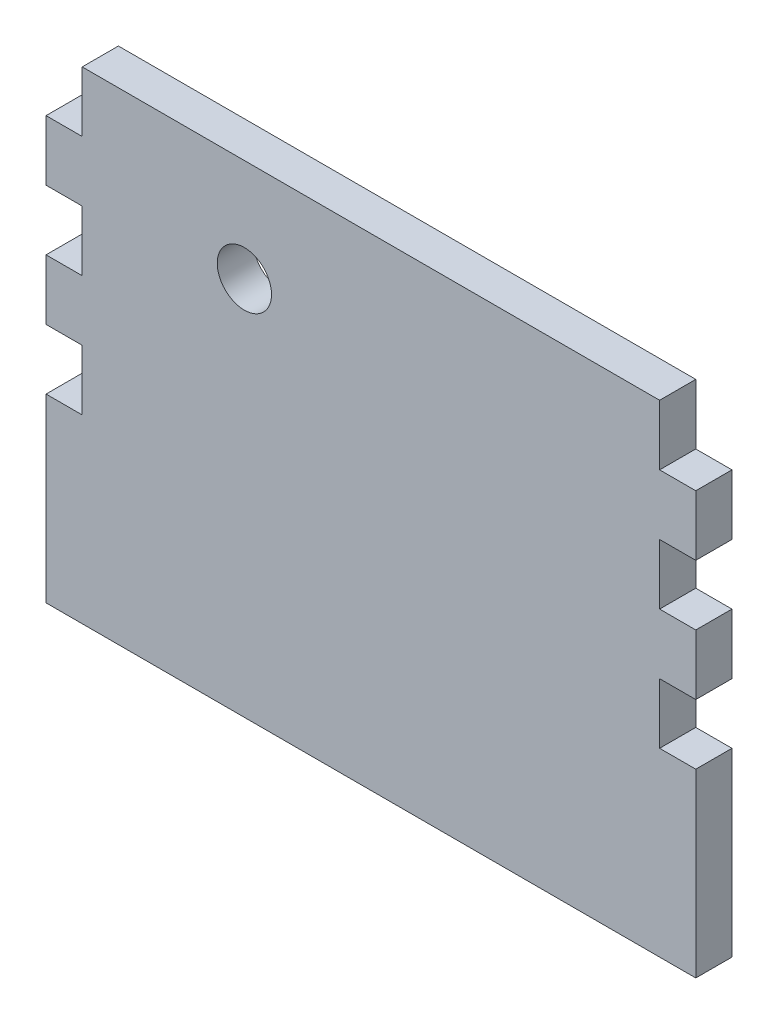
ISO-10303-21;
HEADER;
FILE_DESCRIPTION(('STEP AP214'),'2;1');
FILE_NAME('part.step','',(''),(''),'','','');
FILE_SCHEMA(('AUTOMOTIVE_DESIGN { 1 0 10303 214 1 1 1 1 }'));
ENDSEC;
DATA;
#1=APPLICATION_CONTEXT('core data for automotive mechanical design processes');
#2=APPLICATION_PROTOCOL_DEFINITION('international standard','automotive_design',2000,#1);
#3=PRODUCT_CONTEXT('',#1,'mechanical');
#4=PRODUCT('Part','Part','',(#3));
#5=PRODUCT_RELATED_PRODUCT_CATEGORY('part','',(#4));
#6=PRODUCT_DEFINITION_FORMATION('','',#4);
#7=PRODUCT_DEFINITION_CONTEXT('part definition',#1,'design');
#8=PRODUCT_DEFINITION('design','',#6,#7);
#9=PRODUCT_DEFINITION_SHAPE('','',#8);
#10=(LENGTH_UNIT() NAMED_UNIT(*) SI_UNIT(.MILLI.,.METRE.));
#11=(NAMED_UNIT(*) PLANE_ANGLE_UNIT() SI_UNIT($,.RADIAN.));
#12=(NAMED_UNIT(*) SI_UNIT($,.STERADIAN.) SOLID_ANGLE_UNIT());
#13=UNCERTAINTY_MEASURE_WITH_UNIT(LENGTH_MEASURE(1.E-05),#10,'distance_accuracy_value','');
#14=(GEOMETRIC_REPRESENTATION_CONTEXT(3) GLOBAL_UNCERTAINTY_ASSIGNED_CONTEXT((#13)) GLOBAL_UNIT_ASSIGNED_CONTEXT((#10,
#11,#12)) REPRESENTATION_CONTEXT('',''));
#15=CARTESIAN_POINT('',(0.,0.,0.));
#16=DIRECTION('',(0.,0.,1.));
#17=DIRECTION('',(1.,0.,0.));
#18=AXIS2_PLACEMENT_3D('',#15,#16,#17);
#19=CARTESIAN_POINT('',(-26.945,20.,3.));
#20=DIRECTION('',(1.,0.,0.));
#21=DIRECTION('',(0.,1.,0.));
#22=AXIS2_PLACEMENT_3D('',#19,#20,#21);
#23=PLANE('',#22);
#24=DIRECTION('',(0.,-1.,0.));
#25=VECTOR('',#24,1.);
#26=CARTESIAN_POINT('',(-26.945,20.,0.));
#27=LINE('',#26,#25);
#28=CARTESIAN_POINT('',(-26.945,4.99999999999999,0.));
#29=VERTEX_POINT('',#28);
#30=CARTESIAN_POINT('',(-26.945,0.,0.));
#31=VERTEX_POINT('',#30);
#32=EDGE_CURVE('E411',#29,#31,#27,.T.);
#33=ORIENTED_EDGE('',*,*,#32,.T.);
#34=DIRECTION('',(0.,0.,1.));
#35=VECTOR('',#34,1.);
#36=CARTESIAN_POINT('',(-26.945,0.,0.));
#37=LINE('',#36,#35);
#38=CARTESIAN_POINT('',(-26.945,0.,3.));
#39=VERTEX_POINT('',#38);
#40=EDGE_CURVE('E303',#31,#39,#37,.T.);
#41=ORIENTED_EDGE('',*,*,#40,.T.);
#42=DIRECTION('',(0.,-1.,0.));
#43=VECTOR('',#42,1.);
#44=CARTESIAN_POINT('',(-26.945,20.,3.));
#45=LINE('',#44,#43);
#46=CARTESIAN_POINT('',(-26.945,4.99999999999999,3.));
#47=VERTEX_POINT('',#46);
#48=EDGE_CURVE('E246',#47,#39,#45,.T.);
#49=ORIENTED_EDGE('',*,*,#48,.F.);
#50=DIRECTION('',(0.,0.,1.));
#51=VECTOR('',#50,1.);
#52=CARTESIAN_POINT('',(-26.945,4.99999999999999,0.));
#53=LINE('',#52,#51);
#54=EDGE_CURVE('E336',#29,#47,#53,.T.);
#55=ORIENTED_EDGE('',*,*,#54,.F.);
#56=EDGE_LOOP('',(#33,#41,#49,#55));
#57=FACE_BOUND('',#56,.T.);
#58=ADVANCED_FACE('F33',(#57),#23,.F.);
#59=CARTESIAN_POINT('',(-26.945,15.,0.));
#60=VERTEX_POINT('',#59);
#61=CARTESIAN_POINT('',(-26.945,9.99999999999999,0.));
#62=VERTEX_POINT('',#61);
#63=EDGE_CURVE('E257',#60,#62,#27,.T.);
#64=ORIENTED_EDGE('',*,*,#63,.T.);
#65=DIRECTION('',(0.,0.,1.));
#66=VECTOR('',#65,1.);
#67=CARTESIAN_POINT('',(-26.945,9.99999999999999,0.));
#68=LINE('',#67,#66);
#69=CARTESIAN_POINT('',(-26.945,9.99999999999999,3.));
#70=VERTEX_POINT('',#69);
#71=EDGE_CURVE('E268',#62,#70,#68,.T.);
#72=ORIENTED_EDGE('',*,*,#71,.T.);
#73=CARTESIAN_POINT('',(-26.945,15.,3.));
#74=VERTEX_POINT('',#73);
#75=EDGE_CURVE('E248',#74,#70,#45,.T.);
#76=ORIENTED_EDGE('',*,*,#75,.F.);
#77=DIRECTION('',(0.,0.,1.));
#78=VECTOR('',#77,1.);
#79=CARTESIAN_POINT('',(-26.945,15.,0.));
#80=LINE('',#79,#78);
#81=EDGE_CURVE('E258',#60,#74,#80,.T.);
#82=ORIENTED_EDGE('',*,*,#81,.F.);
#83=EDGE_LOOP('',(#64,#72,#76,#82));
#84=FACE_BOUND('',#83,.T.);
#85=ADVANCED_FACE('F418',(#84),#23,.F.);
#86=CARTESIAN_POINT('',(26.945,20.,3.));
#87=DIRECTION('',(1.,0.,0.));
#88=DIRECTION('',(0.,1.,0.));
#89=AXIS2_PLACEMENT_3D('',#86,#87,#88);
#90=PLANE('',#89);
#91=DIRECTION('',(0.,0.,1.));
#92=VECTOR('',#91,1.);
#93=CARTESIAN_POINT('',(26.945,-5.00000000000001,0.));
#94=LINE('',#93,#92);
#95=CARTESIAN_POINT('',(26.945,-5.00000000000001,0.));
#96=VERTEX_POINT('',#95);
#97=CARTESIAN_POINT('',(26.945,-5.00000000000001,3.));
#98=VERTEX_POINT('',#97);
#99=EDGE_CURVE('E279',#96,#98,#94,.T.);
#100=ORIENTED_EDGE('',*,*,#99,.T.);
#101=DIRECTION('',(0.,-1.,0.));
#102=VECTOR('',#101,1.);
#103=CARTESIAN_POINT('',(26.945,20.,3.));
#104=LINE('',#103,#102);
#105=CARTESIAN_POINT('',(26.945,-20.,3.));
#106=VERTEX_POINT('',#105);
#107=EDGE_CURVE('E251',#98,#106,#104,.T.);
#108=ORIENTED_EDGE('',*,*,#107,.T.);
#109=DIRECTION('',(0.,0.,-1.));
#110=VECTOR('',#109,1.);
#111=CARTESIAN_POINT('',(26.945,-20.,3.));
#112=LINE('',#111,#110);
#113=CARTESIAN_POINT('',(26.945,-20.,0.));
#114=VERTEX_POINT('',#113);
#115=EDGE_CURVE('E37',#106,#114,#112,.T.);
#116=ORIENTED_EDGE('',*,*,#115,.T.);
#117=DIRECTION('',(0.,-1.,0.));
#118=VECTOR('',#117,1.);
#119=CARTESIAN_POINT('',(26.945,20.,0.));
#120=LINE('',#119,#118);
#121=EDGE_CURVE('E226',#96,#114,#120,.T.);
#122=ORIENTED_EDGE('',*,*,#121,.F.);
#123=EDGE_LOOP('',(#100,#108,#116,#122));
#124=FACE_BOUND('',#123,.T.);
#125=ADVANCED_FACE('F402',(#124),#90,.T.);
#126=DIRECTION('',(0.,0.,1.));
#127=VECTOR('',#126,1.);
#128=CARTESIAN_POINT('',(26.945,0.,0.));
#129=LINE('',#128,#127);
#130=CARTESIAN_POINT('',(26.945,0.,0.));
#131=VERTEX_POINT('',#130);
#132=CARTESIAN_POINT('',(26.945,0.,3.));
#133=VERTEX_POINT('',#132);
#134=EDGE_CURVE('E272',#131,#133,#129,.T.);
#135=ORIENTED_EDGE('',*,*,#134,.F.);
#136=CARTESIAN_POINT('',(26.945,4.99999999999999,0.));
#137=VERTEX_POINT('',#136);
#138=EDGE_CURVE('E224',#137,#131,#120,.T.);
#139=ORIENTED_EDGE('',*,*,#138,.F.);
#140=DIRECTION('',(0.,0.,1.));
#141=VECTOR('',#140,1.);
#142=CARTESIAN_POINT('',(26.945,4.99999999999999,0.));
#143=LINE('',#142,#141);
#144=CARTESIAN_POINT('',(26.945,4.99999999999999,3.));
#145=VERTEX_POINT('',#144);
#146=EDGE_CURVE('E333',#137,#145,#143,.T.);
#147=ORIENTED_EDGE('',*,*,#146,.T.);
#148=EDGE_CURVE('E253',#145,#133,#104,.T.);
#149=ORIENTED_EDGE('',*,*,#148,.T.);
#150=EDGE_LOOP('',(#135,#139,#147,#149));
#151=FACE_BOUND('',#150,.T.);
#152=ADVANCED_FACE('F390',(#151),#90,.T.);
#153=CARTESIAN_POINT('',(-26.945,20.,3.));
#154=DIRECTION('',(0.,1.,0.));
#155=DIRECTION('',(0.,0.,1.));
#156=AXIS2_PLACEMENT_3D('',#153,#154,#155);
#157=PLANE('',#156);
#158=DIRECTION('',(0.,0.,1.));
#159=VECTOR('',#158,1.);
#160=CARTESIAN_POINT('',(23.945,20.,0.));
#161=LINE('',#160,#159);
#162=CARTESIAN_POINT('',(23.945,20.,0.));
#163=VERTEX_POINT('',#162);
#164=CARTESIAN_POINT('',(23.945,20.,3.));
#165=VERTEX_POINT('',#164);
#166=EDGE_CURVE('E320',#163,#165,#161,.T.);
#167=ORIENTED_EDGE('',*,*,#166,.F.);
#168=DIRECTION('',(1.,0.,0.));
#169=VECTOR('',#168,1.);
#170=CARTESIAN_POINT('',(-26.945,20.,0.));
#171=LINE('',#170,#169);
#172=CARTESIAN_POINT('',(-23.945,20.,0.));
#173=VERTEX_POINT('',#172);
#174=EDGE_CURVE('E232',#173,#163,#171,.T.);
#175=ORIENTED_EDGE('',*,*,#174,.F.);
#176=DIRECTION('',(0.,0.,1.));
#177=VECTOR('',#176,1.);
#178=CARTESIAN_POINT('',(-23.945,20.,0.));
#179=LINE('',#178,#177);
#180=CARTESIAN_POINT('',(-23.945,20.,3.));
#181=VERTEX_POINT('',#180);
#182=EDGE_CURVE('E237',#173,#181,#179,.T.);
#183=ORIENTED_EDGE('',*,*,#182,.T.);
#184=DIRECTION('',(1.,0.,0.));
#185=VECTOR('',#184,1.);
#186=CARTESIAN_POINT('',(-26.945,20.,3.));
#187=LINE('',#186,#185);
#188=EDGE_CURVE('E254',#181,#165,#187,.T.);
#189=ORIENTED_EDGE('',*,*,#188,.T.);
#190=EDGE_LOOP('',(#167,#175,#183,#189));
#191=FACE_BOUND('',#190,.T.);
#192=ADVANCED_FACE('F35',(#191),#157,.T.);
#193=CARTESIAN_POINT('',(-26.945,-5.00000000000001,3.));
#194=VERTEX_POINT('',#193);
#195=CARTESIAN_POINT('',(-26.945,-20.,3.));
#196=VERTEX_POINT('',#195);
#197=EDGE_CURVE('E244',#194,#196,#45,.T.);
#198=ORIENTED_EDGE('',*,*,#197,.F.);
#199=DIRECTION('',(0.,0.,1.));
#200=VECTOR('',#199,1.);
#201=CARTESIAN_POINT('',(-26.945,-5.00000000000001,0.));
#202=LINE('',#201,#200);
#203=CARTESIAN_POINT('',(-26.945,-5.00000000000001,0.));
#204=VERTEX_POINT('',#203);
#205=EDGE_CURVE('E296',#204,#194,#202,.T.);
#206=ORIENTED_EDGE('',*,*,#205,.F.);
#207=CARTESIAN_POINT('',(-26.945,-20.,0.));
#208=VERTEX_POINT('',#207);
#209=EDGE_CURVE('E228',#204,#208,#27,.T.);
#210=ORIENTED_EDGE('',*,*,#209,.T.);
#211=DIRECTION('',(0.,0.,-1.));
#212=VECTOR('',#211,1.);
#213=CARTESIAN_POINT('',(-26.945,-20.,3.));
#214=LINE('',#213,#212);
#215=EDGE_CURVE('E11',#196,#208,#214,.T.);
#216=ORIENTED_EDGE('',*,*,#215,.F.);
#217=EDGE_LOOP('',(#198,#206,#210,#216));
#218=FACE_BOUND('',#217,.T.);
#219=ADVANCED_FACE('F455',(#218),#23,.F.);
#220=CARTESIAN_POINT('',(-26.945,-20.,3.));
#221=DIRECTION('',(0.,1.,0.));
#222=DIRECTION('',(0.,0.,1.));
#223=AXIS2_PLACEMENT_3D('',#220,#221,#222);
#224=PLANE('',#223);
#225=DIRECTION('',(1.,0.,0.));
#226=VECTOR('',#225,1.);
#227=CARTESIAN_POINT('',(-26.945,-20.,0.));
#228=LINE('',#227,#226);
#229=EDGE_CURVE('E223',#208,#114,#228,.T.);
#230=ORIENTED_EDGE('',*,*,#229,.T.);
#231=ORIENTED_EDGE('',*,*,#115,.F.);
#232=DIRECTION('',(1.,0.,0.));
#233=VECTOR('',#232,1.);
#234=CARTESIAN_POINT('',(-26.945,-20.,3.));
#235=LINE('',#234,#233);
#236=EDGE_CURVE('E247',#196,#106,#235,.T.);
#237=ORIENTED_EDGE('',*,*,#236,.F.);
#238=ORIENTED_EDGE('',*,*,#215,.T.);
#239=EDGE_LOOP('',(#230,#231,#237,#238));
#240=FACE_BOUND('',#239,.T.);
#241=ADVANCED_FACE('F406',(#240),#224,.F.);
#242=DIRECTION('',(0.,0.,1.));
#243=VECTOR('',#242,1.);
#244=CARTESIAN_POINT('',(26.945,15.,0.));
#245=LINE('',#244,#243);
#246=CARTESIAN_POINT('',(26.945,15.,0.));
#247=VERTEX_POINT('',#246);
#248=CARTESIAN_POINT('',(26.945,15.,3.));
#249=VERTEX_POINT('',#248);
#250=EDGE_CURVE('E324',#247,#249,#245,.T.);
#251=ORIENTED_EDGE('',*,*,#250,.T.);
#252=CARTESIAN_POINT('',(26.945,9.99999999999999,3.));
#253=VERTEX_POINT('',#252);
#254=EDGE_CURVE('E214',#249,#253,#104,.T.);
#255=ORIENTED_EDGE('',*,*,#254,.T.);
#256=DIRECTION('',(0.,0.,1.));
#257=VECTOR('',#256,1.);
#258=CARTESIAN_POINT('',(26.945,9.99999999999999,0.));
#259=LINE('',#258,#257);
#260=CARTESIAN_POINT('',(26.945,9.99999999999999,0.));
#261=VERTEX_POINT('',#260);
#262=EDGE_CURVE('E198',#261,#253,#259,.T.);
#263=ORIENTED_EDGE('',*,*,#262,.F.);
#264=EDGE_CURVE('E212',#247,#261,#120,.T.);
#265=ORIENTED_EDGE('',*,*,#264,.F.);
#266=EDGE_LOOP('',(#251,#255,#263,#265));
#267=FACE_BOUND('',#266,.T.);
#268=ADVANCED_FACE('F211',(#267),#90,.T.);
#269=CARTESIAN_POINT('',(0.,0.,3.));
#270=DIRECTION('',(0.,0.,-1.));
#271=DIRECTION('',(-1.,0.,0.));
#272=AXIS2_PLACEMENT_3D('',#269,#270,#271);
#273=PLANE('',#272);
#274=CARTESIAN_POINT('',(-10.495,11.5,3.));
#275=DIRECTION('',(0.,0.,1.));
#276=DIRECTION('',(1.,0.,0.));
#277=AXIS2_PLACEMENT_3D('',#274,#275,#276);
#278=CIRCLE('',#277,2.25);
#279=CARTESIAN_POINT('',(-8.245,11.5,3.));
#280=VERTEX_POINT('',#279);
#281=EDGE_CURVE('E306',#280,#280,#278,.T.);
#282=ORIENTED_EDGE('',*,*,#281,.F.);
#283=EDGE_LOOP('',(#282));
#284=FACE_BOUND('',#283,.T.);
#285=ORIENTED_EDGE('',*,*,#107,.F.);
#286=DIRECTION('',(1.,0.,0.));
#287=VECTOR('',#286,1.);
#288=CARTESIAN_POINT('',(26.945,-5.00000000000001,3.));
#289=LINE('',#288,#287);
#290=CARTESIAN_POINT('',(23.945,-5.00000000000001,3.));
#291=VERTEX_POINT('',#290);
#292=EDGE_CURVE('E283',#291,#98,#289,.T.);
#293=ORIENTED_EDGE('',*,*,#292,.F.);
#294=DIRECTION('',(0.,-1.,0.));
#295=VECTOR('',#294,1.);
#296=CARTESIAN_POINT('',(23.945,0.,3.));
#297=LINE('',#296,#295);
#298=CARTESIAN_POINT('',(23.945,0.,3.));
#299=VERTEX_POINT('',#298);
#300=EDGE_CURVE('E286',#299,#291,#297,.T.);
#301=ORIENTED_EDGE('',*,*,#300,.F.);
#302=DIRECTION('',(-1.,0.,0.));
#303=VECTOR('',#302,1.);
#304=CARTESIAN_POINT('',(26.945,0.,3.));
#305=LINE('',#304,#303);
#306=EDGE_CURVE('E289',#133,#299,#305,.T.);
#307=ORIENTED_EDGE('',*,*,#306,.F.);
#308=ORIENTED_EDGE('',*,*,#148,.F.);
#309=DIRECTION('',(1.,0.,0.));
#310=VECTOR('',#309,1.);
#311=CARTESIAN_POINT('',(26.945,4.99999999999999,3.));
#312=LINE('',#311,#310);
#313=CARTESIAN_POINT('',(23.945,4.99999999999999,3.));
#314=VERTEX_POINT('',#313);
#315=EDGE_CURVE('E205',#314,#145,#312,.T.);
#316=ORIENTED_EDGE('',*,*,#315,.F.);
#317=DIRECTION('',(0.,-1.,0.));
#318=VECTOR('',#317,1.);
#319=CARTESIAN_POINT('',(23.945,4.99999999999999,3.));
#320=LINE('',#319,#318);
#321=CARTESIAN_POINT('',(23.945,9.99999999999999,3.));
#322=VERTEX_POINT('',#321);
#323=EDGE_CURVE('E372',#322,#314,#320,.T.);
#324=ORIENTED_EDGE('',*,*,#323,.F.);
#325=DIRECTION('',(-1.,0.,0.));
#326=VECTOR('',#325,1.);
#327=CARTESIAN_POINT('',(26.945,9.99999999999999,3.));
#328=LINE('',#327,#326);
#329=EDGE_CURVE('E364',#253,#322,#328,.T.);
#330=ORIENTED_EDGE('',*,*,#329,.F.);
#331=ORIENTED_EDGE('',*,*,#254,.F.);
#332=DIRECTION('',(1.,0.,0.));
#333=VECTOR('',#332,1.);
#334=CARTESIAN_POINT('',(26.945,15.,3.));
#335=LINE('',#334,#333);
#336=CARTESIAN_POINT('',(23.945,15.,3.));
#337=VERTEX_POINT('',#336);
#338=EDGE_CURVE('E327',#337,#249,#335,.T.);
#339=ORIENTED_EDGE('',*,*,#338,.F.);
#340=DIRECTION('',(0.,-1.,0.));
#341=VECTOR('',#340,1.);
#342=CARTESIAN_POINT('',(23.945,20.,3.));
#343=LINE('',#342,#341);
#344=EDGE_CURVE('E330',#165,#337,#343,.T.);
#345=ORIENTED_EDGE('',*,*,#344,.F.);
#346=ORIENTED_EDGE('',*,*,#188,.F.);
#347=DIRECTION('',(0.,1.,0.));
#348=VECTOR('',#347,1.);
#349=CARTESIAN_POINT('',(-23.945,20.,3.));
#350=LINE('',#349,#348);
#351=CARTESIAN_POINT('',(-23.945,15.,3.));
#352=VERTEX_POINT('',#351);
#353=EDGE_CURVE('E262',#352,#181,#350,.T.);
#354=ORIENTED_EDGE('',*,*,#353,.F.);
#355=DIRECTION('',(1.,0.,0.));
#356=VECTOR('',#355,1.);
#357=CARTESIAN_POINT('',(-26.945,15.,3.));
#358=LINE('',#357,#356);
#359=EDGE_CURVE('E265',#74,#352,#358,.T.);
#360=ORIENTED_EDGE('',*,*,#359,.F.);
#361=ORIENTED_EDGE('',*,*,#75,.T.);
#362=DIRECTION('',(-1.,0.,0.));
#363=VECTOR('',#362,1.);
#364=CARTESIAN_POINT('',(-26.945,9.99999999999999,3.));
#365=LINE('',#364,#363);
#366=CARTESIAN_POINT('',(-23.945,9.99999999999999,3.));
#367=VERTEX_POINT('',#366);
#368=EDGE_CURVE('E345',#367,#70,#365,.T.);
#369=ORIENTED_EDGE('',*,*,#368,.F.);
#370=DIRECTION('',(0.,1.,0.));
#371=VECTOR('',#370,1.);
#372=CARTESIAN_POINT('',(-23.945,4.99999999999999,3.));
#373=LINE('',#372,#371);
#374=CARTESIAN_POINT('',(-23.945,4.99999999999999,3.));
#375=VERTEX_POINT('',#374);
#376=EDGE_CURVE('E348',#375,#367,#373,.T.);
#377=ORIENTED_EDGE('',*,*,#376,.F.);
#378=DIRECTION('',(1.,0.,0.));
#379=VECTOR('',#378,1.);
#380=CARTESIAN_POINT('',(-26.945,4.99999999999999,3.));
#381=LINE('',#380,#379);
#382=EDGE_CURVE('E326',#47,#375,#381,.T.);
#383=ORIENTED_EDGE('',*,*,#382,.F.);
#384=ORIENTED_EDGE('',*,*,#48,.T.);
#385=DIRECTION('',(-1.,0.,0.));
#386=VECTOR('',#385,1.);
#387=CARTESIAN_POINT('',(-26.945,0.,3.));
#388=LINE('',#387,#386);
#389=CARTESIAN_POINT('',(-23.945,0.,3.));
#390=VERTEX_POINT('',#389);
#391=EDGE_CURVE('E307',#390,#39,#388,.T.);
#392=ORIENTED_EDGE('',*,*,#391,.F.);
#393=DIRECTION('',(0.,1.,0.));
#394=VECTOR('',#393,1.);
#395=CARTESIAN_POINT('',(-23.945,0.,3.));
#396=LINE('',#395,#394);
#397=CARTESIAN_POINT('',(-23.945,-5.00000000000001,3.));
#398=VERTEX_POINT('',#397);
#399=EDGE_CURVE('E310',#398,#390,#396,.T.);
#400=ORIENTED_EDGE('',*,*,#399,.F.);
#401=DIRECTION('',(1.,0.,0.));
#402=VECTOR('',#401,1.);
#403=CARTESIAN_POINT('',(-26.945,-5.00000000000001,3.));
#404=LINE('',#403,#402);
#405=EDGE_CURVE('E282',#194,#398,#404,.T.);
#406=ORIENTED_EDGE('',*,*,#405,.F.);
#407=ORIENTED_EDGE('',*,*,#197,.T.);
#408=ORIENTED_EDGE('',*,*,#236,.T.);
#409=EDGE_LOOP('',(#285,#293,#301,#307,#308,#316,#324,#330,#331,#339,#345,#346,#354,#360,#361,
#369,#377,#383,#384,#392,#400,#406,#407,#408));
#410=FACE_BOUND('',#409,.T.);
#411=ADVANCED_FACE('F394',(#284,#410),#273,.F.);
#412=CARTESIAN_POINT('',(0.,0.,0.));
#413=DIRECTION('',(0.,0.,-1.));
#414=DIRECTION('',(-1.,0.,0.));
#415=AXIS2_PLACEMENT_3D('',#412,#413,#414);
#416=PLANE('',#415);
#417=DIRECTION('',(1.,0.,0.));
#418=VECTOR('',#417,1.);
#419=CARTESIAN_POINT('',(26.945,-5.00000000000001,0.));
#420=LINE('',#419,#418);
#421=CARTESIAN_POINT('',(23.945,-5.00000000000001,0.));
#422=VERTEX_POINT('',#421);
#423=EDGE_CURVE('E275',#422,#96,#420,.T.);
#424=ORIENTED_EDGE('',*,*,#423,.T.);
#425=ORIENTED_EDGE('',*,*,#121,.T.);
#426=ORIENTED_EDGE('',*,*,#229,.F.);
#427=ORIENTED_EDGE('',*,*,#209,.F.);
#428=DIRECTION('',(1.,0.,0.));
#429=VECTOR('',#428,1.);
#430=CARTESIAN_POINT('',(-26.945,-5.00000000000001,0.));
#431=LINE('',#430,#429);
#432=CARTESIAN_POINT('',(-23.945,-5.00000000000001,0.));
#433=VERTEX_POINT('',#432);
#434=EDGE_CURVE('E309',#204,#433,#431,.T.);
#435=ORIENTED_EDGE('',*,*,#434,.T.);
#436=DIRECTION('',(0.,1.,0.));
#437=VECTOR('',#436,1.);
#438=CARTESIAN_POINT('',(-23.945,0.,0.));
#439=LINE('',#438,#437);
#440=CARTESIAN_POINT('',(-23.945,0.,0.));
#441=VERTEX_POINT('',#440);
#442=EDGE_CURVE('E56',#433,#441,#439,.T.);
#443=ORIENTED_EDGE('',*,*,#442,.T.);
#444=DIRECTION('',(-1.,0.,0.));
#445=VECTOR('',#444,1.);
#446=CARTESIAN_POINT('',(-26.945,0.,0.));
#447=LINE('',#446,#445);
#448=EDGE_CURVE('E299',#441,#31,#447,.T.);
#449=ORIENTED_EDGE('',*,*,#448,.T.);
#450=ORIENTED_EDGE('',*,*,#32,.F.);
#451=DIRECTION('',(1.,0.,0.));
#452=VECTOR('',#451,1.);
#453=CARTESIAN_POINT('',(-26.945,4.99999999999999,0.));
#454=LINE('',#453,#452);
#455=CARTESIAN_POINT('',(-23.945,4.99999999999999,0.));
#456=VERTEX_POINT('',#455);
#457=EDGE_CURVE('E347',#29,#456,#454,.T.);
#458=ORIENTED_EDGE('',*,*,#457,.T.);
#459=DIRECTION('',(0.,1.,0.));
#460=VECTOR('',#459,1.);
#461=CARTESIAN_POINT('',(-23.945,4.99999999999999,0.));
#462=LINE('',#461,#460);
#463=CARTESIAN_POINT('',(-23.945,9.99999999999999,0.));
#464=VERTEX_POINT('',#463);
#465=EDGE_CURVE('E355',#456,#464,#462,.T.);
#466=ORIENTED_EDGE('',*,*,#465,.T.);
#467=DIRECTION('',(-1.,0.,0.));
#468=VECTOR('',#467,1.);
#469=CARTESIAN_POINT('',(-26.945,9.99999999999999,0.));
#470=LINE('',#469,#468);
#471=EDGE_CURVE('E339',#464,#62,#470,.T.);
#472=ORIENTED_EDGE('',*,*,#471,.T.);
#473=ORIENTED_EDGE('',*,*,#63,.F.);
#474=DIRECTION('',(1.,0.,0.));
#475=VECTOR('',#474,1.);
#476=CARTESIAN_POINT('',(-26.945,15.,0.));
#477=LINE('',#476,#475);
#478=CARTESIAN_POINT('',(-23.945,15.,0.));
#479=VERTEX_POINT('',#478);
#480=EDGE_CURVE('E264',#60,#479,#477,.T.);
#481=ORIENTED_EDGE('',*,*,#480,.T.);
#482=DIRECTION('',(0.,1.,0.));
#483=VECTOR('',#482,1.);
#484=CARTESIAN_POINT('',(-23.945,20.,0.));
#485=LINE('',#484,#483);
#486=EDGE_CURVE('E260',#479,#173,#485,.T.);
#487=ORIENTED_EDGE('',*,*,#486,.T.);
#488=ORIENTED_EDGE('',*,*,#174,.T.);
#489=DIRECTION('',(0.,-1.,0.));
#490=VECTOR('',#489,1.);
#491=CARTESIAN_POINT('',(23.945,20.,0.));
#492=LINE('',#491,#490);
#493=CARTESIAN_POINT('',(23.945,15.,0.));
#494=VERTEX_POINT('',#493);
#495=EDGE_CURVE('E329',#163,#494,#492,.T.);
#496=ORIENTED_EDGE('',*,*,#495,.T.);
#497=DIRECTION('',(1.,0.,0.));
#498=VECTOR('',#497,1.);
#499=CARTESIAN_POINT('',(26.945,15.,0.));
#500=LINE('',#499,#498);
#501=EDGE_CURVE('E222',#494,#247,#500,.T.);
#502=ORIENTED_EDGE('',*,*,#501,.T.);
#503=ORIENTED_EDGE('',*,*,#264,.T.);
#504=DIRECTION('',(-1.,0.,0.));
#505=VECTOR('',#504,1.);
#506=CARTESIAN_POINT('',(26.945,9.99999999999999,0.));
#507=LINE('',#506,#505);
#508=CARTESIAN_POINT('',(23.945,9.99999999999999,0.));
#509=VERTEX_POINT('',#508);
#510=EDGE_CURVE('E194',#261,#509,#507,.T.);
#511=ORIENTED_EDGE('',*,*,#510,.T.);
#512=DIRECTION('',(0.,-1.,0.));
#513=VECTOR('',#512,1.);
#514=CARTESIAN_POINT('',(23.945,4.99999999999999,0.));
#515=LINE('',#514,#513);
#516=CARTESIAN_POINT('',(23.945,4.99999999999999,0.));
#517=VERTEX_POINT('',#516);
#518=EDGE_CURVE('E204',#509,#517,#515,.T.);
#519=ORIENTED_EDGE('',*,*,#518,.T.);
#520=DIRECTION('',(1.,0.,0.));
#521=VECTOR('',#520,1.);
#522=CARTESIAN_POINT('',(26.945,4.99999999999999,0.));
#523=LINE('',#522,#521);
#524=EDGE_CURVE('E215',#517,#137,#523,.T.);
#525=ORIENTED_EDGE('',*,*,#524,.T.);
#526=ORIENTED_EDGE('',*,*,#138,.T.);
#527=DIRECTION('',(-1.,0.,0.));
#528=VECTOR('',#527,1.);
#529=CARTESIAN_POINT('',(26.945,0.,0.));
#530=LINE('',#529,#528);
#531=CARTESIAN_POINT('',(23.945,0.,0.));
#532=VERTEX_POINT('',#531);
#533=EDGE_CURVE('E285',#131,#532,#530,.T.);
#534=ORIENTED_EDGE('',*,*,#533,.T.);
#535=DIRECTION('',(0.,-1.,0.));
#536=VECTOR('',#535,1.);
#537=CARTESIAN_POINT('',(23.945,0.,0.));
#538=LINE('',#537,#536);
#539=EDGE_CURVE('E48',#532,#422,#538,.T.);
#540=ORIENTED_EDGE('',*,*,#539,.T.);
#541=EDGE_LOOP('',(#424,#425,#426,#427,#435,#443,#449,#450,#458,#466,#472,#473,#481,#487,#488,
#496,#502,#503,#511,#519,#525,#526,#534,#540));
#542=FACE_BOUND('',#541,.T.);
#543=CARTESIAN_POINT('',(-10.495,11.5,0.));
#544=DIRECTION('',(0.,0.,1.));
#545=DIRECTION('',(1.,0.,0.));
#546=AXIS2_PLACEMENT_3D('',#543,#544,#545);
#547=CIRCLE('',#546,2.25);
#548=CARTESIAN_POINT('',(-8.245,11.5,0.));
#549=VERTEX_POINT('',#548);
#550=EDGE_CURVE('E362',#549,#549,#547,.T.);
#551=ORIENTED_EDGE('',*,*,#550,.T.);
#552=EDGE_LOOP('',(#551));
#553=FACE_BOUND('',#552,.T.);
#554=ADVANCED_FACE('F219',(#542,#553),#416,.T.);
#555=CARTESIAN_POINT('',(-23.945,20.,0.));
#556=DIRECTION('',(1.,0.,0.));
#557=DIRECTION('',(0.,0.,-1.));
#558=AXIS2_PLACEMENT_3D('',#555,#556,#557);
#559=PLANE('',#558);
#560=ORIENTED_EDGE('',*,*,#353,.T.);
#561=ORIENTED_EDGE('',*,*,#182,.F.);
#562=ORIENTED_EDGE('',*,*,#486,.F.);
#563=DIRECTION('',(0.,0.,1.));
#564=VECTOR('',#563,1.);
#565=CARTESIAN_POINT('',(-23.945,15.,0.));
#566=LINE('',#565,#564);
#567=EDGE_CURVE('E241',#479,#352,#566,.T.);
#568=ORIENTED_EDGE('',*,*,#567,.T.);
#569=EDGE_LOOP('',(#560,#561,#562,#568));
#570=FACE_BOUND('',#569,.T.);
#571=ADVANCED_FACE('F490',(#570),#559,.F.);
#572=CARTESIAN_POINT('',(-26.945,15.,0.));
#573=DIRECTION('',(0.,-1.,0.));
#574=DIRECTION('',(0.,0.,-1.));
#575=AXIS2_PLACEMENT_3D('',#572,#573,#574);
#576=PLANE('',#575);
#577=ORIENTED_EDGE('',*,*,#359,.T.);
#578=ORIENTED_EDGE('',*,*,#567,.F.);
#579=ORIENTED_EDGE('',*,*,#480,.F.);
#580=ORIENTED_EDGE('',*,*,#81,.T.);
#581=EDGE_LOOP('',(#577,#578,#579,#580));
#582=FACE_BOUND('',#581,.T.);
#583=ADVANCED_FACE('F493',(#582),#576,.F.);
#584=CARTESIAN_POINT('',(-10.495,11.5,0.));
#585=DIRECTION('',(0.,0.,1.));
#586=DIRECTION('',(1.,0.,0.));
#587=AXIS2_PLACEMENT_3D('',#584,#585,#586);
#588=CYLINDRICAL_SURFACE('',#587,2.25);
#589=ORIENTED_EDGE('',*,*,#550,.F.);
#590=EDGE_LOOP('',(#589));
#591=FACE_BOUND('',#590,.T.);
#592=ORIENTED_EDGE('',*,*,#281,.T.);
#593=EDGE_LOOP('',(#592));
#594=FACE_BOUND('',#593,.T.);
#595=ADVANCED_FACE('F497',(#591,#594),#588,.F.);
#596=CARTESIAN_POINT('',(26.945,4.99999999999999,0.));
#597=DIRECTION('',(0.,-1.,0.));
#598=DIRECTION('',(0.,0.,-1.));
#599=AXIS2_PLACEMENT_3D('',#596,#597,#598);
#600=PLANE('',#599);
#601=ORIENTED_EDGE('',*,*,#315,.T.);
#602=ORIENTED_EDGE('',*,*,#146,.F.);
#603=ORIENTED_EDGE('',*,*,#524,.F.);
#604=DIRECTION('',(0.,0.,1.));
#605=VECTOR('',#604,1.);
#606=CARTESIAN_POINT('',(23.945,4.99999999999999,0.));
#607=LINE('',#606,#605);
#608=EDGE_CURVE('E367',#517,#314,#607,.T.);
#609=ORIENTED_EDGE('',*,*,#608,.T.);
#610=EDGE_LOOP('',(#601,#602,#603,#609));
#611=FACE_BOUND('',#610,.T.);
#612=ADVANCED_FACE('F385',(#611),#600,.F.);
#613=CARTESIAN_POINT('',(23.945,4.99999999999999,0.));
#614=DIRECTION('',(-1.,0.,0.));
#615=DIRECTION('',(0.,0.,1.));
#616=AXIS2_PLACEMENT_3D('',#613,#614,#615);
#617=PLANE('',#616);
#618=ORIENTED_EDGE('',*,*,#323,.T.);
#619=ORIENTED_EDGE('',*,*,#608,.F.);
#620=ORIENTED_EDGE('',*,*,#518,.F.);
#621=DIRECTION('',(0.,0.,1.));
#622=VECTOR('',#621,1.);
#623=CARTESIAN_POINT('',(23.945,9.99999999999999,0.));
#624=LINE('',#623,#622);
#625=EDGE_CURVE('E200',#509,#322,#624,.T.);
#626=ORIENTED_EDGE('',*,*,#625,.T.);
#627=EDGE_LOOP('',(#618,#619,#620,#626));
#628=FACE_BOUND('',#627,.T.);
#629=ADVANCED_FACE('F381',(#628),#617,.F.);
#630=CARTESIAN_POINT('',(26.945,9.99999999999999,0.));
#631=DIRECTION('',(0.,1.,0.));
#632=DIRECTION('',(0.,0.,1.));
#633=AXIS2_PLACEMENT_3D('',#630,#631,#632);
#634=PLANE('',#633);
#635=ORIENTED_EDGE('',*,*,#329,.T.);
#636=ORIENTED_EDGE('',*,*,#625,.F.);
#637=ORIENTED_EDGE('',*,*,#510,.F.);
#638=ORIENTED_EDGE('',*,*,#262,.T.);
#639=EDGE_LOOP('',(#635,#636,#637,#638));
#640=FACE_BOUND('',#639,.T.);
#641=ADVANCED_FACE('F197',(#640),#634,.F.);
#642=CARTESIAN_POINT('',(26.945,15.,0.));
#643=DIRECTION('',(0.,-1.,0.));
#644=DIRECTION('',(0.,0.,-1.));
#645=AXIS2_PLACEMENT_3D('',#642,#643,#644);
#646=PLANE('',#645);
#647=ORIENTED_EDGE('',*,*,#338,.T.);
#648=ORIENTED_EDGE('',*,*,#250,.F.);
#649=ORIENTED_EDGE('',*,*,#501,.F.);
#650=DIRECTION('',(0.,0.,1.));
#651=VECTOR('',#650,1.);
#652=CARTESIAN_POINT('',(23.945,15.,0.));
#653=LINE('',#652,#651);
#654=EDGE_CURVE('E322',#494,#337,#653,.T.);
#655=ORIENTED_EDGE('',*,*,#654,.T.);
#656=EDGE_LOOP('',(#647,#648,#649,#655));
#657=FACE_BOUND('',#656,.T.);
#658=ADVANCED_FACE('F540',(#657),#646,.F.);
#659=CARTESIAN_POINT('',(23.945,20.,0.));
#660=DIRECTION('',(-1.,0.,0.));
#661=DIRECTION('',(0.,0.,1.));
#662=AXIS2_PLACEMENT_3D('',#659,#660,#661);
#663=PLANE('',#662);
#664=ORIENTED_EDGE('',*,*,#344,.T.);
#665=ORIENTED_EDGE('',*,*,#654,.F.);
#666=ORIENTED_EDGE('',*,*,#495,.F.);
#667=ORIENTED_EDGE('',*,*,#166,.T.);
#668=EDGE_LOOP('',(#664,#665,#666,#667));
#669=FACE_BOUND('',#668,.T.);
#670=ADVANCED_FACE('F451',(#669),#663,.F.);
#671=CARTESIAN_POINT('',(-26.945,9.99999999999999,0.));
#672=DIRECTION('',(0.,1.,0.));
#673=DIRECTION('',(0.,0.,1.));
#674=AXIS2_PLACEMENT_3D('',#671,#672,#673);
#675=PLANE('',#674);
#676=ORIENTED_EDGE('',*,*,#368,.T.);
#677=ORIENTED_EDGE('',*,*,#71,.F.);
#678=ORIENTED_EDGE('',*,*,#471,.F.);
#679=DIRECTION('',(0.,0.,1.));
#680=VECTOR('',#679,1.);
#681=CARTESIAN_POINT('',(-23.945,9.99999999999999,0.));
#682=LINE('',#681,#680);
#683=EDGE_CURVE('E341',#464,#367,#682,.T.);
#684=ORIENTED_EDGE('',*,*,#683,.T.);
#685=EDGE_LOOP('',(#676,#677,#678,#684));
#686=FACE_BOUND('',#685,.T.);
#687=ADVANCED_FACE('F423',(#686),#675,.F.);
#688=CARTESIAN_POINT('',(-23.945,4.99999999999999,0.));
#689=DIRECTION('',(1.,0.,0.));
#690=DIRECTION('',(0.,0.,-1.));
#691=AXIS2_PLACEMENT_3D('',#688,#689,#690);
#692=PLANE('',#691);
#693=ORIENTED_EDGE('',*,*,#376,.T.);
#694=ORIENTED_EDGE('',*,*,#683,.F.);
#695=ORIENTED_EDGE('',*,*,#465,.F.);
#696=DIRECTION('',(0.,0.,1.));
#697=VECTOR('',#696,1.);
#698=CARTESIAN_POINT('',(-23.945,4.99999999999999,0.));
#699=LINE('',#698,#697);
#700=EDGE_CURVE('E338',#456,#375,#699,.T.);
#701=ORIENTED_EDGE('',*,*,#700,.T.);
#702=EDGE_LOOP('',(#693,#694,#695,#701));
#703=FACE_BOUND('',#702,.T.);
#704=ADVANCED_FACE('F443',(#703),#692,.F.);
#705=CARTESIAN_POINT('',(-26.945,4.99999999999999,0.));
#706=DIRECTION('',(0.,-1.,0.));
#707=DIRECTION('',(0.,0.,-1.));
#708=AXIS2_PLACEMENT_3D('',#705,#706,#707);
#709=PLANE('',#708);
#710=ORIENTED_EDGE('',*,*,#382,.T.);
#711=ORIENTED_EDGE('',*,*,#700,.F.);
#712=ORIENTED_EDGE('',*,*,#457,.F.);
#713=ORIENTED_EDGE('',*,*,#54,.T.);
#714=EDGE_LOOP('',(#710,#711,#712,#713));
#715=FACE_BOUND('',#714,.T.);
#716=ADVANCED_FACE('F441',(#715),#709,.F.);
#717=CARTESIAN_POINT('',(-26.945,0.,0.));
#718=DIRECTION('',(0.,1.,0.));
#719=DIRECTION('',(-1.,0.,0.));
#720=AXIS2_PLACEMENT_3D('',#717,#718,#719);
#721=PLANE('',#720);
#722=ORIENTED_EDGE('',*,*,#391,.T.);
#723=ORIENTED_EDGE('',*,*,#40,.F.);
#724=ORIENTED_EDGE('',*,*,#448,.F.);
#725=DIRECTION('',(0.,0.,1.));
#726=VECTOR('',#725,1.);
#727=CARTESIAN_POINT('',(-23.945,0.,0.));
#728=LINE('',#727,#726);
#729=EDGE_CURVE('E301',#441,#390,#728,.T.);
#730=ORIENTED_EDGE('',*,*,#729,.T.);
#731=EDGE_LOOP('',(#722,#723,#724,#730));
#732=FACE_BOUND('',#731,.T.);
#733=ADVANCED_FACE('F438',(#732),#721,.F.);
#734=CARTESIAN_POINT('',(-23.945,0.,0.));
#735=DIRECTION('',(1.,0.,0.));
#736=DIRECTION('',(0.,0.,-1.));
#737=AXIS2_PLACEMENT_3D('',#734,#735,#736);
#738=PLANE('',#737);
#739=ORIENTED_EDGE('',*,*,#399,.T.);
#740=ORIENTED_EDGE('',*,*,#729,.F.);
#741=ORIENTED_EDGE('',*,*,#442,.F.);
#742=DIRECTION('',(0.,0.,1.));
#743=VECTOR('',#742,1.);
#744=CARTESIAN_POINT('',(-23.945,-5.00000000000001,0.));
#745=LINE('',#744,#743);
#746=EDGE_CURVE('E298',#433,#398,#745,.T.);
#747=ORIENTED_EDGE('',*,*,#746,.T.);
#748=EDGE_LOOP('',(#739,#740,#741,#747));
#749=FACE_BOUND('',#748,.T.);
#750=ADVANCED_FACE('F471',(#749),#738,.F.);
#751=CARTESIAN_POINT('',(-26.945,-5.00000000000001,0.));
#752=DIRECTION('',(0.,-1.,0.));
#753=DIRECTION('',(0.,0.,-1.));
#754=AXIS2_PLACEMENT_3D('',#751,#752,#753);
#755=PLANE('',#754);
#756=ORIENTED_EDGE('',*,*,#405,.T.);
#757=ORIENTED_EDGE('',*,*,#746,.F.);
#758=ORIENTED_EDGE('',*,*,#434,.F.);
#759=ORIENTED_EDGE('',*,*,#205,.T.);
#760=EDGE_LOOP('',(#756,#757,#758,#759));
#761=FACE_BOUND('',#760,.T.);
#762=ADVANCED_FACE('F470',(#761),#755,.F.);
#763=CARTESIAN_POINT('',(26.945,-5.00000000000001,0.));
#764=DIRECTION('',(0.,-1.,0.));
#765=DIRECTION('',(0.,0.,-1.));
#766=AXIS2_PLACEMENT_3D('',#763,#764,#765);
#767=PLANE('',#766);
#768=ORIENTED_EDGE('',*,*,#292,.T.);
#769=ORIENTED_EDGE('',*,*,#99,.F.);
#770=ORIENTED_EDGE('',*,*,#423,.F.);
#771=DIRECTION('',(0.,0.,1.));
#772=VECTOR('',#771,1.);
#773=CARTESIAN_POINT('',(23.945,-5.00000000000001,0.));
#774=LINE('',#773,#772);
#775=EDGE_CURVE('E277',#422,#291,#774,.T.);
#776=ORIENTED_EDGE('',*,*,#775,.T.);
#777=EDGE_LOOP('',(#768,#769,#770,#776));
#778=FACE_BOUND('',#777,.T.);
#779=ADVANCED_FACE('F478',(#778),#767,.F.);
#780=CARTESIAN_POINT('',(23.945,0.,0.));
#781=DIRECTION('',(-1.,0.,0.));
#782=DIRECTION('',(0.,0.,1.));
#783=AXIS2_PLACEMENT_3D('',#780,#781,#782);
#784=PLANE('',#783);
#785=ORIENTED_EDGE('',*,*,#300,.T.);
#786=ORIENTED_EDGE('',*,*,#775,.F.);
#787=ORIENTED_EDGE('',*,*,#539,.F.);
#788=DIRECTION('',(0.,0.,1.));
#789=VECTOR('',#788,1.);
#790=CARTESIAN_POINT('',(23.945,0.,0.));
#791=LINE('',#790,#789);
#792=EDGE_CURVE('E274',#532,#299,#791,.T.);
#793=ORIENTED_EDGE('',*,*,#792,.T.);
#794=EDGE_LOOP('',(#785,#786,#787,#793));
#795=FACE_BOUND('',#794,.T.);
#796=ADVANCED_FACE('F485',(#795),#784,.F.);
#797=CARTESIAN_POINT('',(26.945,0.,0.));
#798=DIRECTION('',(0.,1.,0.));
#799=DIRECTION('',(-1.,0.,0.));
#800=AXIS2_PLACEMENT_3D('',#797,#798,#799);
#801=PLANE('',#800);
#802=ORIENTED_EDGE('',*,*,#306,.T.);
#803=ORIENTED_EDGE('',*,*,#792,.F.);
#804=ORIENTED_EDGE('',*,*,#533,.F.);
#805=ORIENTED_EDGE('',*,*,#134,.T.);
#806=EDGE_LOOP('',(#802,#803,#804,#805));
#807=FACE_BOUND('',#806,.T.);
#808=ADVANCED_FACE('F398',(#807),#801,.F.);
#809=CLOSED_SHELL('',(#58,#85,#125,#152,#192,#219,#241,#268,#411,#554,#571,#583,#595,#612,#629,
#641,#658,#670,#687,#704,#716,#733,#750,#762,#779,#796,#808));
#810=MANIFOLD_SOLID_BREP('B2',#809);
#811=ADVANCED_BREP_SHAPE_REPRESENTATION('',(#18,#810),#14);
#812=SHAPE_DEFINITION_REPRESENTATION(#9,#811);
ENDSEC;
END-ISO-10303-21;
